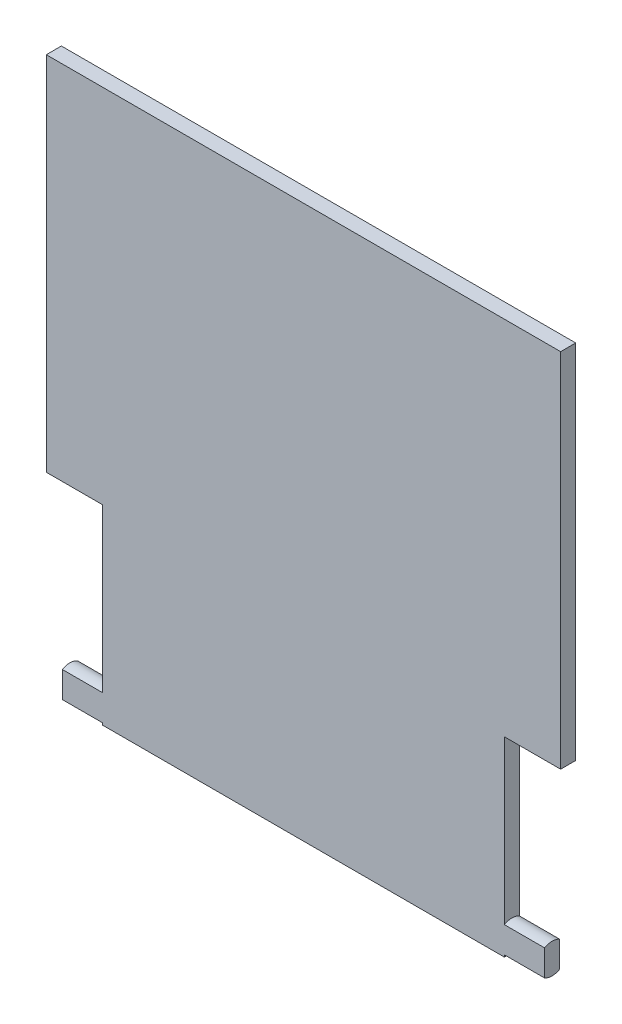
ISO-10303-21;
HEADER;
FILE_DESCRIPTION(('STEP AP214'),'2;1');
FILE_NAME('part.step','',(''),(''),'','','');
FILE_SCHEMA(('AUTOMOTIVE_DESIGN { 1 0 10303 214 1 1 1 1 }'));
ENDSEC;
DATA;
#1=APPLICATION_CONTEXT('core data for automotive mechanical design processes');
#2=APPLICATION_PROTOCOL_DEFINITION('international standard','automotive_design',2000,#1);
#3=PRODUCT_CONTEXT('',#1,'mechanical');
#4=PRODUCT('Part','Part','',(#3));
#5=PRODUCT_RELATED_PRODUCT_CATEGORY('part','',(#4));
#6=PRODUCT_DEFINITION_FORMATION('','',#4);
#7=PRODUCT_DEFINITION_CONTEXT('part definition',#1,'design');
#8=PRODUCT_DEFINITION('design','',#6,#7);
#9=PRODUCT_DEFINITION_SHAPE('','',#8);
#10=(LENGTH_UNIT() NAMED_UNIT(*) SI_UNIT(.MILLI.,.METRE.));
#11=(NAMED_UNIT(*) PLANE_ANGLE_UNIT() SI_UNIT($,.RADIAN.));
#12=(NAMED_UNIT(*) SI_UNIT($,.STERADIAN.) SOLID_ANGLE_UNIT());
#13=UNCERTAINTY_MEASURE_WITH_UNIT(LENGTH_MEASURE(1.E-05),#10,'distance_accuracy_value','');
#14=(GEOMETRIC_REPRESENTATION_CONTEXT(3) GLOBAL_UNCERTAINTY_ASSIGNED_CONTEXT((#13)) GLOBAL_UNIT_ASSIGNED_CONTEXT((#10,
#11,#12)) REPRESENTATION_CONTEXT('',''));
#15=CARTESIAN_POINT('',(0.,0.,0.));
#16=DIRECTION('',(0.,0.,1.));
#17=DIRECTION('',(1.,0.,0.));
#18=AXIS2_PLACEMENT_3D('',#15,#16,#17);
#19=CARTESIAN_POINT('',(0.,0.,0.75));
#20=DIRECTION('',(0.,0.,-1.));
#21=DIRECTION('',(-1.,0.,0.));
#22=AXIS2_PLACEMENT_3D('',#19,#20,#21);
#23=PLANE('',#22);
#24=DIRECTION('',(1.,0.,0.));
#25=VECTOR('',#24,1.);
#26=CARTESIAN_POINT('',(5.57478461016845,0.100480947161669,0.75));
#27=LINE('',#26,#25);
#28=CARTESIAN_POINT('',(12.,0.100480947161669,0.75));
#29=VERTEX_POINT('',#28);
#30=CARTESIAN_POINT('',(10.,0.100480947161669,0.75));
#31=VERTEX_POINT('',#30);
#32=EDGE_CURVE('E277',#29,#31,#27,.F.);
#33=ORIENTED_EDGE('',*,*,#32,.F.);
#34=DIRECTION('',(0.,1.,0.));
#35=VECTOR('',#34,1.);
#36=CARTESIAN_POINT('',(12.,0.,0.75));
#37=LINE('',#36,#35);
#38=CARTESIAN_POINT('',(12.,1.39951905283833,0.75));
#39=VERTEX_POINT('',#38);
#40=EDGE_CURVE('E244',#29,#39,#37,.T.);
#41=ORIENTED_EDGE('',*,*,#40,.T.);
#42=DIRECTION('',(1.,0.,0.));
#43=VECTOR('',#42,1.);
#44=CARTESIAN_POINT('',(5.57478461016845,1.39951905283833,0.75));
#45=LINE('',#44,#43);
#46=CARTESIAN_POINT('',(10.,1.39951905283833,0.75));
#47=VERTEX_POINT('',#46);
#48=EDGE_CURVE('E269',#47,#39,#45,.T.);
#49=ORIENTED_EDGE('',*,*,#48,.F.);
#50=DIRECTION('',(0.,1.,0.));
#51=VECTOR('',#50,1.);
#52=CARTESIAN_POINT('',(10.,1.5,0.75));
#53=LINE('',#52,#51);
#54=CARTESIAN_POINT('',(10.,9.5,0.75));
#55=VERTEX_POINT('',#54);
#56=EDGE_CURVE('E97',#47,#55,#53,.T.);
#57=ORIENTED_EDGE('',*,*,#56,.T.);
#58=DIRECTION('',(1.,0.,0.));
#59=VECTOR('',#58,1.);
#60=CARTESIAN_POINT('',(10.,9.5,0.75));
#61=LINE('',#60,#59);
#62=CARTESIAN_POINT('',(12.8,9.5,0.75));
#63=VERTEX_POINT('',#62);
#64=EDGE_CURVE('E252',#55,#63,#61,.T.);
#65=ORIENTED_EDGE('',*,*,#64,.T.);
#66=DIRECTION('',(0.,1.,0.));
#67=VECTOR('',#66,1.);
#68=CARTESIAN_POINT('',(12.8,9.5,0.75));
#69=LINE('',#68,#67);
#70=CARTESIAN_POINT('',(12.8,27.5,0.75));
#71=VERTEX_POINT('',#70);
#72=EDGE_CURVE('E114',#63,#71,#69,.T.);
#73=ORIENTED_EDGE('',*,*,#72,.T.);
#74=DIRECTION('',(-1.,0.,0.));
#75=VECTOR('',#74,1.);
#76=CARTESIAN_POINT('',(-12.8,27.5,0.75));
#77=LINE('',#76,#75);
#78=CARTESIAN_POINT('',(-12.8,27.5,0.75));
#79=VERTEX_POINT('',#78);
#80=EDGE_CURVE('E107',#71,#79,#77,.T.);
#81=ORIENTED_EDGE('',*,*,#80,.T.);
#82=DIRECTION('',(0.,-1.,0.));
#83=VECTOR('',#82,1.);
#84=CARTESIAN_POINT('',(-12.8,9.5,0.75));
#85=LINE('',#84,#83);
#86=CARTESIAN_POINT('',(-12.8,9.5,0.75));
#87=VERTEX_POINT('',#86);
#88=EDGE_CURVE('E111',#79,#87,#85,.T.);
#89=ORIENTED_EDGE('',*,*,#88,.T.);
#90=DIRECTION('',(1.,0.,0.));
#91=VECTOR('',#90,1.);
#92=CARTESIAN_POINT('',(-10.,9.5,0.75));
#93=LINE('',#92,#91);
#94=CARTESIAN_POINT('',(-10.,9.5,0.75));
#95=VERTEX_POINT('',#94);
#96=EDGE_CURVE('E62',#87,#95,#93,.T.);
#97=ORIENTED_EDGE('',*,*,#96,.T.);
#98=DIRECTION('',(0.,-1.,0.));
#99=VECTOR('',#98,1.);
#100=CARTESIAN_POINT('',(-10.,1.5,0.75));
#101=LINE('',#100,#99);
#102=CARTESIAN_POINT('',(-10.,1.39951905283833,0.75));
#103=VERTEX_POINT('',#102);
#104=EDGE_CURVE('E131',#95,#103,#101,.T.);
#105=ORIENTED_EDGE('',*,*,#104,.T.);
#106=DIRECTION('',(-1.,0.,0.));
#107=VECTOR('',#106,1.);
#108=CARTESIAN_POINT('',(-5.51828563707356,1.39951905283833,0.75));
#109=LINE('',#108,#107);
#110=CARTESIAN_POINT('',(-12.,1.39951905283833,0.75));
#111=VERTEX_POINT('',#110);
#112=EDGE_CURVE('E237',#111,#103,#109,.F.);
#113=ORIENTED_EDGE('',*,*,#112,.F.);
#114=DIRECTION('',(0.,-1.,0.));
#115=VECTOR('',#114,1.);
#116=CARTESIAN_POINT('',(-12.,0.,0.75));
#117=LINE('',#116,#115);
#118=CARTESIAN_POINT('',(-12.,0.100480947161671,0.75));
#119=VERTEX_POINT('',#118);
#120=EDGE_CURVE('E160',#111,#119,#117,.T.);
#121=ORIENTED_EDGE('',*,*,#120,.T.);
#122=DIRECTION('',(-1.,0.,0.));
#123=VECTOR('',#122,1.);
#124=CARTESIAN_POINT('',(-5.51828563707356,0.100480947161671,0.75));
#125=LINE('',#124,#123);
#126=CARTESIAN_POINT('',(-10.,0.100480947161671,0.75));
#127=VERTEX_POINT('',#126);
#128=EDGE_CURVE('E141',#127,#119,#125,.T.);
#129=ORIENTED_EDGE('',*,*,#128,.F.);
#130=DIRECTION('',(0.,-1.,0.));
#131=VECTOR('',#130,1.);
#132=CARTESIAN_POINT('',(-10.,0.,0.75));
#133=LINE('',#132,#131);
#134=CARTESIAN_POINT('',(-10.,0.,0.75));
#135=VERTEX_POINT('',#134);
#136=EDGE_CURVE('E223',#127,#135,#133,.T.);
#137=ORIENTED_EDGE('',*,*,#136,.T.);
#138=DIRECTION('',(1.,0.,0.));
#139=VECTOR('',#138,1.);
#140=CARTESIAN_POINT('',(12.,0.,0.75));
#141=LINE('',#140,#139);
#142=CARTESIAN_POINT('',(10.,0.,0.75));
#143=VERTEX_POINT('',#142);
#144=EDGE_CURVE('E236',#135,#143,#141,.T.);
#145=ORIENTED_EDGE('',*,*,#144,.T.);
#146=DIRECTION('',(0.,1.,0.));
#147=VECTOR('',#146,1.);
#148=CARTESIAN_POINT('',(10.,0.,0.75));
#149=LINE('',#148,#147);
#150=EDGE_CURVE('E270',#143,#31,#149,.T.);
#151=ORIENTED_EDGE('',*,*,#150,.T.);
#152=EDGE_LOOP('',(#33,#41,#49,#57,#65,#73,#81,#89,#97,#105,#113,#121,#129,#137,#145,#151));
#153=FACE_BOUND('',#152,.T.);
#154=ADVANCED_FACE('F38',(#153),#23,.F.);
#155=CARTESIAN_POINT('',(0.,0.,0.));
#156=DIRECTION('',(0.,0.,-1.));
#157=DIRECTION('',(-1.,0.,0.));
#158=AXIS2_PLACEMENT_3D('',#155,#156,#157);
#159=PLANE('',#158);
#160=DIRECTION('',(0.,1.,0.));
#161=VECTOR('',#160,1.);
#162=CARTESIAN_POINT('',(12.,0.,0.));
#163=LINE('',#162,#161);
#164=CARTESIAN_POINT('',(12.,0.100480947161669,0.));
#165=VERTEX_POINT('',#164);
#166=CARTESIAN_POINT('',(12.,1.39951905283833,0.));
#167=VERTEX_POINT('',#166);
#168=EDGE_CURVE('E144',#165,#167,#163,.T.);
#169=ORIENTED_EDGE('',*,*,#168,.F.);
#170=DIRECTION('',(1.,0.,0.));
#171=VECTOR('',#170,1.);
#172=CARTESIAN_POINT('',(5.57478461016845,0.100480947161669,0.));
#173=LINE('',#172,#171);
#174=CARTESIAN_POINT('',(10.,0.100480947161669,0.));
#175=VERTEX_POINT('',#174);
#176=EDGE_CURVE('E283',#165,#175,#173,.F.);
#177=ORIENTED_EDGE('',*,*,#176,.T.);
#178=DIRECTION('',(0.,1.,0.));
#179=VECTOR('',#178,1.);
#180=CARTESIAN_POINT('',(10.,0.,0.));
#181=LINE('',#180,#179);
#182=CARTESIAN_POINT('',(10.,0.,0.));
#183=VERTEX_POINT('',#182);
#184=EDGE_CURVE('E272',#183,#175,#181,.T.);
#185=ORIENTED_EDGE('',*,*,#184,.F.);
#186=DIRECTION('',(1.,0.,0.));
#187=VECTOR('',#186,1.);
#188=CARTESIAN_POINT('',(12.,0.,0.));
#189=LINE('',#188,#187);
#190=CARTESIAN_POINT('',(-10.,0.,0.));
#191=VERTEX_POINT('',#190);
#192=EDGE_CURVE('E140',#191,#183,#189,.T.);
#193=ORIENTED_EDGE('',*,*,#192,.F.);
#194=DIRECTION('',(0.,-1.,0.));
#195=VECTOR('',#194,1.);
#196=CARTESIAN_POINT('',(-10.,0.,0.));
#197=LINE('',#196,#195);
#198=CARTESIAN_POINT('',(-10.,0.100480947161671,0.));
#199=VERTEX_POINT('',#198);
#200=EDGE_CURVE('E170',#199,#191,#197,.T.);
#201=ORIENTED_EDGE('',*,*,#200,.F.);
#202=DIRECTION('',(-1.,0.,0.));
#203=VECTOR('',#202,1.);
#204=CARTESIAN_POINT('',(-5.51828563707356,0.100480947161671,0.));
#205=LINE('',#204,#203);
#206=CARTESIAN_POINT('',(-12.,0.100480947161671,0.));
#207=VERTEX_POINT('',#206);
#208=EDGE_CURVE('E46',#199,#207,#205,.T.);
#209=ORIENTED_EDGE('',*,*,#208,.T.);
#210=DIRECTION('',(0.,-1.,0.));
#211=VECTOR('',#210,1.);
#212=CARTESIAN_POINT('',(-12.,0.,0.));
#213=LINE('',#212,#211);
#214=CARTESIAN_POINT('',(-12.,1.39951905283833,0.));
#215=VERTEX_POINT('',#214);
#216=EDGE_CURVE('E137',#215,#207,#213,.T.);
#217=ORIENTED_EDGE('',*,*,#216,.F.);
#218=DIRECTION('',(-1.,0.,0.));
#219=VECTOR('',#218,1.);
#220=CARTESIAN_POINT('',(-5.51828563707356,1.39951905283833,0.));
#221=LINE('',#220,#219);
#222=CARTESIAN_POINT('',(-10.,1.39951905283833,0.));
#223=VERTEX_POINT('',#222);
#224=EDGE_CURVE('E11',#215,#223,#221,.F.);
#225=ORIENTED_EDGE('',*,*,#224,.T.);
#226=DIRECTION('',(0.,-1.,0.));
#227=VECTOR('',#226,1.);
#228=CARTESIAN_POINT('',(-10.,1.5,0.));
#229=LINE('',#228,#227);
#230=CARTESIAN_POINT('',(-10.,9.5,0.));
#231=VERTEX_POINT('',#230);
#232=EDGE_CURVE('E157',#231,#223,#229,.T.);
#233=ORIENTED_EDGE('',*,*,#232,.F.);
#234=DIRECTION('',(1.,0.,0.));
#235=VECTOR('',#234,1.);
#236=CARTESIAN_POINT('',(-10.,9.5,0.));
#237=LINE('',#236,#235);
#238=CARTESIAN_POINT('',(-12.8,9.5,0.));
#239=VERTEX_POINT('',#238);
#240=EDGE_CURVE('E89',#239,#231,#237,.T.);
#241=ORIENTED_EDGE('',*,*,#240,.F.);
#242=DIRECTION('',(0.,-1.,0.));
#243=VECTOR('',#242,1.);
#244=CARTESIAN_POINT('',(-12.8,9.5,0.));
#245=LINE('',#244,#243);
#246=CARTESIAN_POINT('',(-12.8,27.5,0.));
#247=VERTEX_POINT('',#246);
#248=EDGE_CURVE('E154',#247,#239,#245,.T.);
#249=ORIENTED_EDGE('',*,*,#248,.F.);
#250=DIRECTION('',(-1.,0.,0.));
#251=VECTOR('',#250,1.);
#252=CARTESIAN_POINT('',(-12.8,27.5,0.));
#253=LINE('',#252,#251);
#254=CARTESIAN_POINT('',(12.8,27.5,0.));
#255=VERTEX_POINT('',#254);
#256=EDGE_CURVE('E123',#255,#247,#253,.T.);
#257=ORIENTED_EDGE('',*,*,#256,.F.);
#258=DIRECTION('',(0.,1.,0.));
#259=VECTOR('',#258,1.);
#260=CARTESIAN_POINT('',(12.8,9.5,0.));
#261=LINE('',#260,#259);
#262=CARTESIAN_POINT('',(12.8,9.5,0.));
#263=VERTEX_POINT('',#262);
#264=EDGE_CURVE('E151',#263,#255,#261,.T.);
#265=ORIENTED_EDGE('',*,*,#264,.F.);
#266=DIRECTION('',(1.,0.,0.));
#267=VECTOR('',#266,1.);
#268=CARTESIAN_POINT('',(10.,9.5,0.));
#269=LINE('',#268,#267);
#270=CARTESIAN_POINT('',(10.,9.5,0.));
#271=VERTEX_POINT('',#270);
#272=EDGE_CURVE('E149',#271,#263,#269,.T.);
#273=ORIENTED_EDGE('',*,*,#272,.F.);
#274=DIRECTION('',(0.,1.,0.));
#275=VECTOR('',#274,1.);
#276=CARTESIAN_POINT('',(10.,1.5,0.));
#277=LINE('',#276,#275);
#278=CARTESIAN_POINT('',(10.,1.39951905283833,0.));
#279=VERTEX_POINT('',#278);
#280=EDGE_CURVE('E147',#279,#271,#277,.T.);
#281=ORIENTED_EDGE('',*,*,#280,.F.);
#282=DIRECTION('',(1.,0.,0.));
#283=VECTOR('',#282,1.);
#284=CARTESIAN_POINT('',(5.57478461016845,1.39951905283833,0.));
#285=LINE('',#284,#283);
#286=EDGE_CURVE('E280',#279,#167,#285,.T.);
#287=ORIENTED_EDGE('',*,*,#286,.T.);
#288=EDGE_LOOP('',(#169,#177,#185,#193,#201,#209,#217,#225,#233,#241,#249,#257,#265,#273,#281,#287));
#289=FACE_BOUND('',#288,.T.);
#290=ADVANCED_FACE('F177',(#289),#159,.T.);
#291=CARTESIAN_POINT('',(12.,0.,0.75));
#292=DIRECTION('',(-1.,0.,0.));
#293=DIRECTION('',(0.,0.,1.));
#294=AXIS2_PLACEMENT_3D('',#291,#292,#293);
#295=PLANE('',#294);
#296=CARTESIAN_POINT('',(12.,0.749999999999999,0.375));
#297=DIRECTION('',(1.,0.,0.));
#298=DIRECTION('',(0.,0.,-1.));
#299=AXIS2_PLACEMENT_3D('',#296,#297,#298);
#300=CIRCLE('',#299,0.750000000000001);
#301=EDGE_CURVE('E293',#167,#39,#300,.T.);
#302=ORIENTED_EDGE('',*,*,#301,.T.);
#303=ORIENTED_EDGE('',*,*,#40,.F.);
#304=EDGE_CURVE('E291',#29,#165,#300,.T.);
#305=ORIENTED_EDGE('',*,*,#304,.T.);
#306=ORIENTED_EDGE('',*,*,#168,.T.);
#307=EDGE_LOOP('',(#302,#303,#305,#306));
#308=FACE_BOUND('',#307,.T.);
#309=ADVANCED_FACE('F325',(#308),#295,.F.);
#310=CARTESIAN_POINT('',(-12.,0.,0.75));
#311=DIRECTION('',(1.,0.,0.));
#312=DIRECTION('',(0.,0.,-1.));
#313=AXIS2_PLACEMENT_3D('',#310,#311,#312);
#314=PLANE('',#313);
#315=CARTESIAN_POINT('',(-12.,0.749999999999999,0.375));
#316=DIRECTION('',(-1.,0.,0.));
#317=DIRECTION('',(0.,0.,1.));
#318=AXIS2_PLACEMENT_3D('',#315,#316,#317);
#319=CIRCLE('',#318,0.749999999999999);
#320=EDGE_CURVE('E189',#111,#215,#319,.T.);
#321=ORIENTED_EDGE('',*,*,#320,.T.);
#322=ORIENTED_EDGE('',*,*,#216,.T.);
#323=EDGE_CURVE('E186',#207,#119,#319,.T.);
#324=ORIENTED_EDGE('',*,*,#323,.T.);
#325=ORIENTED_EDGE('',*,*,#120,.F.);
#326=EDGE_LOOP('',(#321,#322,#324,#325));
#327=FACE_BOUND('',#326,.T.);
#328=ADVANCED_FACE('F40',(#327),#314,.F.);
#329=CARTESIAN_POINT('',(12.,0.,0.75));
#330=DIRECTION('',(0.,1.,0.));
#331=DIRECTION('',(-1.,0.,0.));
#332=AXIS2_PLACEMENT_3D('',#329,#330,#331);
#333=PLANE('',#332);
#334=ORIENTED_EDGE('',*,*,#192,.T.);
#335=DIRECTION('',(0.,0.,1.));
#336=VECTOR('',#335,1.);
#337=CARTESIAN_POINT('',(10.,0.,0.75));
#338=LINE('',#337,#336);
#339=CARTESIAN_POINT('',(10.,0.,0.375));
#340=VERTEX_POINT('',#339);
#341=EDGE_CURVE('E268',#183,#340,#338,.T.);
#342=ORIENTED_EDGE('',*,*,#341,.T.);
#343=EDGE_CURVE('E243',#340,#143,#338,.T.);
#344=ORIENTED_EDGE('',*,*,#343,.T.);
#345=ORIENTED_EDGE('',*,*,#144,.F.);
#346=DIRECTION('',(0.,0.,-1.));
#347=VECTOR('',#346,1.);
#348=CARTESIAN_POINT('',(-10.,0.,0.75));
#349=LINE('',#348,#347);
#350=CARTESIAN_POINT('',(-10.,0.,0.375));
#351=VERTEX_POINT('',#350);
#352=EDGE_CURVE('E220',#135,#351,#349,.T.);
#353=ORIENTED_EDGE('',*,*,#352,.T.);
#354=EDGE_CURVE('E230',#351,#191,#349,.T.);
#355=ORIENTED_EDGE('',*,*,#354,.T.);
#356=EDGE_LOOP('',(#334,#342,#344,#345,#353,#355));
#357=FACE_BOUND('',#356,.T.);
#358=ADVANCED_FACE('F240',(#357),#333,.F.);
#359=CARTESIAN_POINT('',(10.,1.5,0.75));
#360=DIRECTION('',(-1.,0.,0.));
#361=DIRECTION('',(0.,0.,1.));
#362=AXIS2_PLACEMENT_3D('',#359,#360,#361);
#363=PLANE('',#362);
#364=DIRECTION('',(0.,0.,-1.));
#365=VECTOR('',#364,1.);
#366=CARTESIAN_POINT('',(10.,9.5,0.75));
#367=LINE('',#366,#365);
#368=EDGE_CURVE('E167',#55,#271,#367,.T.);
#369=ORIENTED_EDGE('',*,*,#368,.F.);
#370=ORIENTED_EDGE('',*,*,#56,.F.);
#371=CARTESIAN_POINT('',(10.,0.749999999999999,0.375));
#372=DIRECTION('',(-1.,0.,0.));
#373=DIRECTION('',(0.,0.,1.));
#374=AXIS2_PLACEMENT_3D('',#371,#372,#373);
#375=CIRCLE('',#374,0.750000000000001);
#376=EDGE_CURVE('E290',#279,#47,#375,.F.);
#377=ORIENTED_EDGE('',*,*,#376,.F.);
#378=ORIENTED_EDGE('',*,*,#280,.T.);
#379=EDGE_LOOP('',(#369,#370,#377,#378));
#380=FACE_BOUND('',#379,.T.);
#381=ADVANCED_FACE('F342',(#380),#363,.F.);
#382=CARTESIAN_POINT('',(10.,9.5,0.75));
#383=DIRECTION('',(0.,1.,0.));
#384=DIRECTION('',(0.,0.,1.));
#385=AXIS2_PLACEMENT_3D('',#382,#383,#384);
#386=PLANE('',#385);
#387=ORIENTED_EDGE('',*,*,#272,.T.);
#388=DIRECTION('',(0.,0.,-1.));
#389=VECTOR('',#388,1.);
#390=CARTESIAN_POINT('',(12.8,9.5,0.75));
#391=LINE('',#390,#389);
#392=EDGE_CURVE('E164',#63,#263,#391,.T.);
#393=ORIENTED_EDGE('',*,*,#392,.F.);
#394=ORIENTED_EDGE('',*,*,#64,.F.);
#395=ORIENTED_EDGE('',*,*,#368,.T.);
#396=EDGE_LOOP('',(#387,#393,#394,#395));
#397=FACE_BOUND('',#396,.T.);
#398=ADVANCED_FACE('F256',(#397),#386,.F.);
#399=CARTESIAN_POINT('',(12.8,9.5,0.75));
#400=DIRECTION('',(-1.,0.,0.));
#401=DIRECTION('',(0.,-1.,0.));
#402=AXIS2_PLACEMENT_3D('',#399,#400,#401);
#403=PLANE('',#402);
#404=ORIENTED_EDGE('',*,*,#264,.T.);
#405=DIRECTION('',(0.,0.,-1.));
#406=VECTOR('',#405,1.);
#407=CARTESIAN_POINT('',(12.8,27.5,0.75));
#408=LINE('',#407,#406);
#409=EDGE_CURVE('E126',#71,#255,#408,.T.);
#410=ORIENTED_EDGE('',*,*,#409,.F.);
#411=ORIENTED_EDGE('',*,*,#72,.F.);
#412=ORIENTED_EDGE('',*,*,#392,.T.);
#413=EDGE_LOOP('',(#404,#410,#411,#412));
#414=FACE_BOUND('',#413,.T.);
#415=ADVANCED_FACE('F260',(#414),#403,.F.);
#416=CARTESIAN_POINT('',(-12.8,27.5,0.75));
#417=DIRECTION('',(0.,-1.,0.));
#418=DIRECTION('',(1.,0.,0.));
#419=AXIS2_PLACEMENT_3D('',#416,#417,#418);
#420=PLANE('',#419);
#421=ORIENTED_EDGE('',*,*,#256,.T.);
#422=DIRECTION('',(0.,0.,-1.));
#423=VECTOR('',#422,1.);
#424=CARTESIAN_POINT('',(-12.8,27.5,0.75));
#425=LINE('',#424,#423);
#426=EDGE_CURVE('E120',#79,#247,#425,.T.);
#427=ORIENTED_EDGE('',*,*,#426,.F.);
#428=ORIENTED_EDGE('',*,*,#80,.F.);
#429=ORIENTED_EDGE('',*,*,#409,.T.);
#430=EDGE_LOOP('',(#421,#427,#428,#429));
#431=FACE_BOUND('',#430,.T.);
#432=ADVANCED_FACE('F121',(#431),#420,.F.);
#433=CARTESIAN_POINT('',(-12.8,9.5,0.75));
#434=DIRECTION('',(1.,0.,0.));
#435=DIRECTION('',(0.,0.,-1.));
#436=AXIS2_PLACEMENT_3D('',#433,#434,#435);
#437=PLANE('',#436);
#438=ORIENTED_EDGE('',*,*,#248,.T.);
#439=DIRECTION('',(0.,0.,-1.));
#440=VECTOR('',#439,1.);
#441=CARTESIAN_POINT('',(-12.8,9.5,0.75));
#442=LINE('',#441,#440);
#443=EDGE_CURVE('E127',#87,#239,#442,.T.);
#444=ORIENTED_EDGE('',*,*,#443,.F.);
#445=ORIENTED_EDGE('',*,*,#88,.F.);
#446=ORIENTED_EDGE('',*,*,#426,.T.);
#447=EDGE_LOOP('',(#438,#444,#445,#446));
#448=FACE_BOUND('',#447,.T.);
#449=ADVANCED_FACE('F129',(#448),#437,.F.);
#450=CARTESIAN_POINT('',(-10.,9.5,0.75));
#451=DIRECTION('',(0.,1.,0.));
#452=DIRECTION('',(-1.,0.,0.));
#453=AXIS2_PLACEMENT_3D('',#450,#451,#452);
#454=PLANE('',#453);
#455=ORIENTED_EDGE('',*,*,#240,.T.);
#456=DIRECTION('',(0.,0.,-1.));
#457=VECTOR('',#456,1.);
#458=CARTESIAN_POINT('',(-10.,9.5,0.75));
#459=LINE('',#458,#457);
#460=EDGE_CURVE('E136',#95,#231,#459,.T.);
#461=ORIENTED_EDGE('',*,*,#460,.F.);
#462=ORIENTED_EDGE('',*,*,#96,.F.);
#463=ORIENTED_EDGE('',*,*,#443,.T.);
#464=EDGE_LOOP('',(#455,#461,#462,#463));
#465=FACE_BOUND('',#464,.T.);
#466=ADVANCED_FACE('F261',(#465),#454,.F.);
#467=CARTESIAN_POINT('',(-10.,1.5,0.75));
#468=DIRECTION('',(1.,0.,0.));
#469=DIRECTION('',(0.,0.,-1.));
#470=AXIS2_PLACEMENT_3D('',#467,#468,#469);
#471=PLANE('',#470);
#472=ORIENTED_EDGE('',*,*,#232,.T.);
#473=CARTESIAN_POINT('',(-10.,0.749999999999999,0.375));
#474=DIRECTION('',(1.,0.,0.));
#475=DIRECTION('',(0.,0.,-1.));
#476=AXIS2_PLACEMENT_3D('',#473,#474,#475);
#477=CIRCLE('',#476,0.749999999999999);
#478=EDGE_CURVE('E197',#103,#223,#477,.F.);
#479=ORIENTED_EDGE('',*,*,#478,.F.);
#480=ORIENTED_EDGE('',*,*,#104,.F.);
#481=ORIENTED_EDGE('',*,*,#460,.T.);
#482=EDGE_LOOP('',(#472,#479,#480,#481));
#483=FACE_BOUND('',#482,.T.);
#484=ADVANCED_FACE('F263',(#483),#471,.F.);
#485=EDGE_CURVE('E53',#199,#351,#477,.F.);
#486=ORIENTED_EDGE('',*,*,#485,.F.);
#487=ORIENTED_EDGE('',*,*,#200,.T.);
#488=ORIENTED_EDGE('',*,*,#354,.F.);
#489=EDGE_LOOP('',(#486,#487,#488));
#490=FACE_BOUND('',#489,.T.);
#491=ADVANCED_FACE('F337',(#490),#471,.F.);
#492=CARTESIAN_POINT('',(-5.51828563707356,0.749999999999999,0.375));
#493=DIRECTION('',(-1.,0.,0.));
#494=DIRECTION('',(0.,0.,1.));
#495=AXIS2_PLACEMENT_3D('',#492,#493,#494);
#496=CYLINDRICAL_SURFACE('',#495,0.749999999999999);
#497=ORIENTED_EDGE('',*,*,#485,.T.);
#498=EDGE_CURVE('E226',#351,#127,#477,.F.);
#499=ORIENTED_EDGE('',*,*,#498,.T.);
#500=ORIENTED_EDGE('',*,*,#128,.T.);
#501=ORIENTED_EDGE('',*,*,#323,.F.);
#502=ORIENTED_EDGE('',*,*,#208,.F.);
#503=EDGE_LOOP('',(#497,#499,#500,#501,#502));
#504=FACE_BOUND('',#503,.T.);
#505=ADVANCED_FACE('F361',(#504),#496,.T.);
#506=ORIENTED_EDGE('',*,*,#498,.F.);
#507=ORIENTED_EDGE('',*,*,#352,.F.);
#508=ORIENTED_EDGE('',*,*,#136,.F.);
#509=EDGE_LOOP('',(#506,#507,#508));
#510=FACE_BOUND('',#509,.T.);
#511=ADVANCED_FACE('F222',(#510),#471,.F.);
#512=ORIENTED_EDGE('',*,*,#112,.T.);
#513=ORIENTED_EDGE('',*,*,#478,.T.);
#514=ORIENTED_EDGE('',*,*,#224,.F.);
#515=ORIENTED_EDGE('',*,*,#320,.F.);
#516=EDGE_LOOP('',(#512,#513,#514,#515));
#517=FACE_BOUND('',#516,.T.);
#518=ADVANCED_FACE('F200',(#517),#496,.T.);
#519=CARTESIAN_POINT('',(5.57478461016845,0.749999999999999,0.375));
#520=DIRECTION('',(1.,0.,0.));
#521=DIRECTION('',(0.,0.,-1.));
#522=AXIS2_PLACEMENT_3D('',#519,#520,#521);
#523=CYLINDRICAL_SURFACE('',#522,0.750000000000001);
#524=ORIENTED_EDGE('',*,*,#48,.T.);
#525=ORIENTED_EDGE('',*,*,#301,.F.);
#526=ORIENTED_EDGE('',*,*,#286,.F.);
#527=ORIENTED_EDGE('',*,*,#376,.T.);
#528=EDGE_LOOP('',(#524,#525,#526,#527));
#529=FACE_BOUND('',#528,.T.);
#530=ADVANCED_FACE('F347',(#529),#523,.T.);
#531=ORIENTED_EDGE('',*,*,#343,.F.);
#532=EDGE_CURVE('E286',#31,#340,#375,.F.);
#533=ORIENTED_EDGE('',*,*,#532,.F.);
#534=ORIENTED_EDGE('',*,*,#150,.F.);
#535=EDGE_LOOP('',(#531,#533,#534));
#536=FACE_BOUND('',#535,.T.);
#537=ADVANCED_FACE('F341',(#536),#363,.F.);
#538=ORIENTED_EDGE('',*,*,#32,.T.);
#539=ORIENTED_EDGE('',*,*,#532,.T.);
#540=EDGE_CURVE('E289',#340,#175,#375,.F.);
#541=ORIENTED_EDGE('',*,*,#540,.T.);
#542=ORIENTED_EDGE('',*,*,#176,.F.);
#543=ORIENTED_EDGE('',*,*,#304,.F.);
#544=EDGE_LOOP('',(#538,#539,#541,#542,#543));
#545=FACE_BOUND('',#544,.T.);
#546=ADVANCED_FACE('F311',(#545),#523,.T.);
#547=ORIENTED_EDGE('',*,*,#184,.T.);
#548=ORIENTED_EDGE('',*,*,#540,.F.);
#549=ORIENTED_EDGE('',*,*,#341,.F.);
#550=EDGE_LOOP('',(#547,#548,#549));
#551=FACE_BOUND('',#550,.T.);
#552=ADVANCED_FACE('F338',(#551),#363,.F.);
#553=CLOSED_SHELL('',(#154,#290,#309,#328,#358,#381,#398,#415,#432,#449,#466,#484,#491,#505,
#511,#518,#530,#537,#546,#552));
#554=MANIFOLD_SOLID_BREP('B2',#553);
#555=ADVANCED_BREP_SHAPE_REPRESENTATION('',(#18,#554),#14);
#556=SHAPE_DEFINITION_REPRESENTATION(#9,#555);
ENDSEC;
END-ISO-10303-21;
